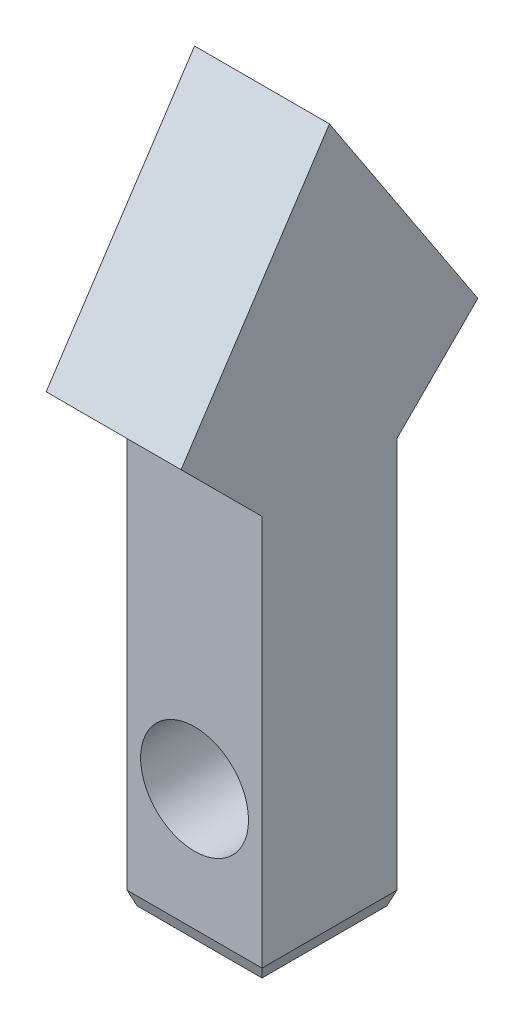
ISO-10303-21;
HEADER;
FILE_DESCRIPTION(('STEP AP214'),'2;1');
FILE_NAME('part.step','',(''),(''),'','','');
FILE_SCHEMA(('AUTOMOTIVE_DESIGN { 1 0 10303 214 1 1 1 1 }'));
ENDSEC;
DATA;
#1=APPLICATION_CONTEXT('core data for automotive mechanical design processes');
#2=APPLICATION_PROTOCOL_DEFINITION('international standard','automotive_design',2000,#1);
#3=PRODUCT_CONTEXT('',#1,'mechanical');
#4=PRODUCT('Part','Part','',(#3));
#5=PRODUCT_RELATED_PRODUCT_CATEGORY('part','',(#4));
#6=PRODUCT_DEFINITION_FORMATION('','',#4);
#7=PRODUCT_DEFINITION_CONTEXT('part definition',#1,'design');
#8=PRODUCT_DEFINITION('design','',#6,#7);
#9=PRODUCT_DEFINITION_SHAPE('','',#8);
#10=(LENGTH_UNIT() NAMED_UNIT(*) SI_UNIT(.MILLI.,.METRE.));
#11=(NAMED_UNIT(*) PLANE_ANGLE_UNIT() SI_UNIT($,.RADIAN.));
#12=(NAMED_UNIT(*) SI_UNIT($,.STERADIAN.) SOLID_ANGLE_UNIT());
#13=UNCERTAINTY_MEASURE_WITH_UNIT(LENGTH_MEASURE(1.E-05),#10,'distance_accuracy_value','');
#14=(GEOMETRIC_REPRESENTATION_CONTEXT(3) GLOBAL_UNCERTAINTY_ASSIGNED_CONTEXT((#13)) GLOBAL_UNIT_ASSIGNED_CONTEXT((#10,
#11,#12)) REPRESENTATION_CONTEXT('',''));
#15=CARTESIAN_POINT('',(0.,0.,0.));
#16=DIRECTION('',(0.,0.,1.));
#17=DIRECTION('',(1.,0.,0.));
#18=AXIS2_PLACEMENT_3D('',#15,#16,#17);
#19=CARTESIAN_POINT('',(5.,1.99999999999999,8.));
#20=DIRECTION('',(0.,0.707106781186547,-0.707106781186549));
#21=DIRECTION('',(0.,0.707106781186549,0.707106781186547));
#22=AXIS2_PLACEMENT_3D('',#19,#20,#21);
#23=PLANE('',#22);
#24=DIRECTION('',(0.,-0.707106781186549,-0.707106781186547));
#25=VECTOR('',#24,1.);
#26=CARTESIAN_POINT('',(0.,1.99999999999999,8.));
#27=LINE('',#26,#25);
#28=CARTESIAN_POINT('',(0.,5.,11.));
#29=VERTEX_POINT('',#28);
#30=CARTESIAN_POINT('',(0.,1.99999999999999,8.));
#31=VERTEX_POINT('',#30);
#32=EDGE_CURVE('E137',#29,#31,#27,.T.);
#33=ORIENTED_EDGE('',*,*,#32,.T.);
#34=DIRECTION('',(-1.,0.,0.));
#35=VECTOR('',#34,1.);
#36=CARTESIAN_POINT('',(5.,1.99999999999999,8.));
#37=LINE('',#36,#35);
#38=CARTESIAN_POINT('',(5.,1.99999999999999,8.));
#39=VERTEX_POINT('',#38);
#40=EDGE_CURVE('E118',#39,#31,#37,.T.);
#41=ORIENTED_EDGE('',*,*,#40,.F.);
#42=DIRECTION('',(0.,-0.707106781186549,-0.707106781186547));
#43=VECTOR('',#42,1.);
#44=CARTESIAN_POINT('',(5.,1.99999999999999,8.));
#45=LINE('',#44,#43);
#46=CARTESIAN_POINT('',(5.,5.,11.));
#47=VERTEX_POINT('',#46);
#48=EDGE_CURVE('E125',#47,#39,#45,.T.);
#49=ORIENTED_EDGE('',*,*,#48,.F.);
#50=DIRECTION('',(-1.,0.,0.));
#51=VECTOR('',#50,1.);
#52=CARTESIAN_POINT('',(5.,5.,11.));
#53=LINE('',#52,#51);
#54=EDGE_CURVE('E185',#47,#29,#53,.T.);
#55=ORIENTED_EDGE('',*,*,#54,.T.);
#56=EDGE_LOOP('',(#33,#41,#49,#55));
#57=FACE_BOUND('',#56,.T.);
#58=ADVANCED_FACE('F41',(#57),#23,.F.);
#59=CARTESIAN_POINT('',(5.,-3.,8.));
#60=DIRECTION('',(0.,0.,-1.));
#61=DIRECTION('',(0.,1.,0.));
#62=AXIS2_PLACEMENT_3D('',#59,#60,#61);
#63=PLANE('',#62);
#64=CARTESIAN_POINT('',(2.5,-7.99999999999999,8.));
#65=DIRECTION('',(0.,0.,1.));
#66=DIRECTION('',(1.,0.,0.));
#67=AXIS2_PLACEMENT_3D('',#64,#65,#66);
#68=CIRCLE('',#67,2.);
#69=CARTESIAN_POINT('',(4.5,-7.99999999999999,8.));
#70=VERTEX_POINT('',#69);
#71=EDGE_CURVE('E150',#70,#70,#68,.T.);
#72=ORIENTED_EDGE('',*,*,#71,.F.);
#73=EDGE_LOOP('',(#72));
#74=FACE_BOUND('',#73,.T.);
#75=DIRECTION('',(0.,-1.,0.));
#76=VECTOR('',#75,1.);
#77=CARTESIAN_POINT('',(0.,-3.,8.));
#78=LINE('',#77,#76);
#79=CARTESIAN_POINT('',(0.,-12.5,8.));
#80=VERTEX_POINT('',#79);
#81=EDGE_CURVE('E187',#31,#80,#78,.T.);
#82=ORIENTED_EDGE('',*,*,#81,.T.);
#83=DIRECTION('',(1.,0.,0.));
#84=VECTOR('',#83,1.);
#85=CARTESIAN_POINT('',(5.,-12.5,8.));
#86=LINE('',#85,#84);
#87=CARTESIAN_POINT('',(5.,-12.5,8.));
#88=VERTEX_POINT('',#87);
#89=EDGE_CURVE('E11',#80,#88,#86,.T.);
#90=ORIENTED_EDGE('',*,*,#89,.T.);
#91=DIRECTION('',(0.,-1.,0.));
#92=VECTOR('',#91,1.);
#93=CARTESIAN_POINT('',(5.,-3.,8.));
#94=LINE('',#93,#92);
#95=EDGE_CURVE('E114',#39,#88,#94,.T.);
#96=ORIENTED_EDGE('',*,*,#95,.F.);
#97=ORIENTED_EDGE('',*,*,#40,.T.);
#98=EDGE_LOOP('',(#82,#90,#96,#97));
#99=FACE_BOUND('',#98,.T.);
#100=ADVANCED_FACE('F116',(#74,#99),#63,.F.);
#101=CARTESIAN_POINT('',(5.,-13.,8.));
#102=DIRECTION('',(0.,1.,0.));
#103=DIRECTION('',(0.,0.,1.));
#104=AXIS2_PLACEMENT_3D('',#101,#102,#103);
#105=PLANE('',#104);
#106=DIRECTION('',(1.,0.,0.));
#107=VECTOR('',#106,1.);
#108=CARTESIAN_POINT('',(5.,-13.,3.18198511713311));
#109=LINE('',#108,#107);
#110=CARTESIAN_POINT('',(0.181985117133104,-13.,3.18198511713311));
#111=VERTEX_POINT('',#110);
#112=CARTESIAN_POINT('',(4.8180148828669,-13.,3.18198511713311));
#113=VERTEX_POINT('',#112);
#114=EDGE_CURVE('E155',#111,#113,#109,.T.);
#115=ORIENTED_EDGE('',*,*,#114,.T.);
#116=DIRECTION('',(0.,0.,1.));
#117=VECTOR('',#116,1.);
#118=CARTESIAN_POINT('',(4.8180148828669,-13.,8.));
#119=LINE('',#118,#117);
#120=CARTESIAN_POINT('',(4.8180148828669,-13.,7.8180148828669));
#121=VERTEX_POINT('',#120);
#122=EDGE_CURVE('E157',#113,#121,#119,.T.);
#123=ORIENTED_EDGE('',*,*,#122,.T.);
#124=DIRECTION('',(-1.,0.,0.));
#125=VECTOR('',#124,1.);
#126=CARTESIAN_POINT('',(5.,-13.,7.8180148828669));
#127=LINE('',#126,#125);
#128=CARTESIAN_POINT('',(0.181985117133104,-13.,7.8180148828669));
#129=VERTEX_POINT('',#128);
#130=EDGE_CURVE('E141',#121,#129,#127,.T.);
#131=ORIENTED_EDGE('',*,*,#130,.T.);
#132=DIRECTION('',(0.,0.,-1.));
#133=VECTOR('',#132,1.);
#134=CARTESIAN_POINT('',(0.181985117133104,-13.,3.));
#135=LINE('',#134,#133);
#136=EDGE_CURVE('E153',#129,#111,#135,.T.);
#137=ORIENTED_EDGE('',*,*,#136,.T.);
#138=EDGE_LOOP('',(#115,#123,#131,#137));
#139=FACE_BOUND('',#138,.T.);
#140=ADVANCED_FACE('F230',(#139),#105,.F.);
#141=CARTESIAN_POINT('',(5.,-2.99999999999999,3.));
#142=DIRECTION('',(0.,0.,1.));
#143=DIRECTION('',(1.,0.,0.));
#144=AXIS2_PLACEMENT_3D('',#141,#142,#143);
#145=PLANE('',#144);
#146=CARTESIAN_POINT('',(2.5,-7.99999999999999,3.));
#147=DIRECTION('',(0.,0.,1.));
#148=DIRECTION('',(1.,0.,0.));
#149=AXIS2_PLACEMENT_3D('',#146,#147,#148);
#150=CIRCLE('',#149,2.);
#151=CARTESIAN_POINT('',(4.5,-7.99999999999999,3.));
#152=VERTEX_POINT('',#151);
#153=EDGE_CURVE('E148',#152,#152,#150,.T.);
#154=ORIENTED_EDGE('',*,*,#153,.T.);
#155=EDGE_LOOP('',(#154));
#156=FACE_BOUND('',#155,.T.);
#157=DIRECTION('',(0.,1.,0.));
#158=VECTOR('',#157,1.);
#159=CARTESIAN_POINT('',(5.,-13.,3.));
#160=LINE('',#159,#158);
#161=CARTESIAN_POINT('',(5.,-12.5,3.));
#162=VERTEX_POINT('',#161);
#163=CARTESIAN_POINT('',(5.,1.99999999999999,3.));
#164=VERTEX_POINT('',#163);
#165=EDGE_CURVE('E124',#162,#164,#160,.T.);
#166=ORIENTED_EDGE('',*,*,#165,.F.);
#167=DIRECTION('',(-1.,0.,0.));
#168=VECTOR('',#167,1.);
#169=CARTESIAN_POINT('',(5.,-12.5,3.));
#170=LINE('',#169,#168);
#171=CARTESIAN_POINT('',(0.,-12.5,3.));
#172=VERTEX_POINT('',#171);
#173=EDGE_CURVE('E66',#162,#172,#170,.T.);
#174=ORIENTED_EDGE('',*,*,#173,.T.);
#175=DIRECTION('',(0.,1.,0.));
#176=VECTOR('',#175,1.);
#177=CARTESIAN_POINT('',(0.,-2.99999999999999,3.));
#178=LINE('',#177,#176);
#179=CARTESIAN_POINT('',(0.,1.99999999999999,3.));
#180=VERTEX_POINT('',#179);
#181=EDGE_CURVE('E189',#172,#180,#178,.T.);
#182=ORIENTED_EDGE('',*,*,#181,.T.);
#183=DIRECTION('',(-1.,0.,0.));
#184=VECTOR('',#183,1.);
#185=CARTESIAN_POINT('',(5.,1.99999999999999,3.));
#186=LINE('',#185,#184);
#187=EDGE_CURVE('E139',#164,#180,#186,.T.);
#188=ORIENTED_EDGE('',*,*,#187,.F.);
#189=EDGE_LOOP('',(#166,#174,#182,#188));
#190=FACE_BOUND('',#189,.T.);
#191=ADVANCED_FACE('F267',(#156,#190),#145,.F.);
#192=CARTESIAN_POINT('',(5.,1.99999999999999,3.));
#193=DIRECTION('',(0.,0.707106781186547,0.707106781186548));
#194=DIRECTION('',(0.,-0.707106781186548,0.707106781186547));
#195=AXIS2_PLACEMENT_3D('',#192,#193,#194);
#196=PLANE('',#195);
#197=DIRECTION('',(0.,0.707106781186548,-0.707106781186547));
#198=VECTOR('',#197,1.);
#199=CARTESIAN_POINT('',(0.,1.99999999999999,3.));
#200=LINE('',#199,#198);
#201=CARTESIAN_POINT('',(0.,5.,0.));
#202=VERTEX_POINT('',#201);
#203=EDGE_CURVE('E191',#180,#202,#200,.T.);
#204=ORIENTED_EDGE('',*,*,#203,.T.);
#205=DIRECTION('',(-1.,0.,0.));
#206=VECTOR('',#205,1.);
#207=CARTESIAN_POINT('',(5.,5.,0.));
#208=LINE('',#207,#206);
#209=CARTESIAN_POINT('',(5.,5.,0.));
#210=VERTEX_POINT('',#209);
#211=EDGE_CURVE('E144',#210,#202,#208,.T.);
#212=ORIENTED_EDGE('',*,*,#211,.F.);
#213=DIRECTION('',(0.,0.707106781186548,-0.707106781186547));
#214=VECTOR('',#213,1.);
#215=CARTESIAN_POINT('',(5.,1.99999999999999,3.));
#216=LINE('',#215,#214);
#217=EDGE_CURVE('E180',#164,#210,#216,.T.);
#218=ORIENTED_EDGE('',*,*,#217,.F.);
#219=ORIENTED_EDGE('',*,*,#187,.T.);
#220=EDGE_LOOP('',(#204,#212,#218,#219));
#221=FACE_BOUND('',#220,.T.);
#222=ADVANCED_FACE('F221',(#221),#196,.F.);
#223=CARTESIAN_POINT('',(5.,13.351646544245,5.5));
#224=DIRECTION('',(0.,-0.55,0.835164654424503));
#225=DIRECTION('',(0.,-0.835164654424503,-0.55));
#226=AXIS2_PLACEMENT_3D('',#223,#224,#225);
#227=PLANE('',#226);
#228=DIRECTION('',(0.,0.835164654424503,0.55));
#229=VECTOR('',#228,1.);
#230=CARTESIAN_POINT('',(0.,13.351646544245,5.5));
#231=LINE('',#230,#229);
#232=CARTESIAN_POINT('',(0.,13.351646544245,5.5));
#233=VERTEX_POINT('',#232);
#234=EDGE_CURVE('E193',#202,#233,#231,.T.);
#235=ORIENTED_EDGE('',*,*,#234,.T.);
#236=DIRECTION('',(-1.,0.,0.));
#237=VECTOR('',#236,1.);
#238=CARTESIAN_POINT('',(5.,13.351646544245,5.5));
#239=LINE('',#238,#237);
#240=CARTESIAN_POINT('',(5.,13.351646544245,5.5));
#241=VERTEX_POINT('',#240);
#242=EDGE_CURVE('E197',#241,#233,#239,.T.);
#243=ORIENTED_EDGE('',*,*,#242,.F.);
#244=DIRECTION('',(0.,0.835164654424503,0.55));
#245=VECTOR('',#244,1.);
#246=CARTESIAN_POINT('',(5.,13.351646544245,5.5));
#247=LINE('',#246,#245);
#248=EDGE_CURVE('E182',#210,#241,#247,.T.);
#249=ORIENTED_EDGE('',*,*,#248,.F.);
#250=ORIENTED_EDGE('',*,*,#211,.T.);
#251=EDGE_LOOP('',(#235,#243,#249,#250));
#252=FACE_BOUND('',#251,.T.);
#253=ADVANCED_FACE('F204',(#252),#227,.F.);
#254=CARTESIAN_POINT('',(5.,5.,11.));
#255=DIRECTION('',(0.,-0.55,-0.835164654424503));
#256=DIRECTION('',(0.,0.835164654424504,-0.55));
#257=AXIS2_PLACEMENT_3D('',#254,#255,#256);
#258=PLANE('',#257);
#259=DIRECTION('',(0.,-0.835164654424503,0.55));
#260=VECTOR('',#259,1.);
#261=CARTESIAN_POINT('',(0.,5.,11.));
#262=LINE('',#261,#260);
#263=EDGE_CURVE('E134',#233,#29,#262,.T.);
#264=ORIENTED_EDGE('',*,*,#263,.T.);
#265=ORIENTED_EDGE('',*,*,#54,.F.);
#266=DIRECTION('',(0.,-0.835164654424503,0.55));
#267=VECTOR('',#266,1.);
#268=CARTESIAN_POINT('',(5.,5.,11.));
#269=LINE('',#268,#267);
#270=EDGE_CURVE('E130',#241,#47,#269,.T.);
#271=ORIENTED_EDGE('',*,*,#270,.F.);
#272=ORIENTED_EDGE('',*,*,#242,.T.);
#273=EDGE_LOOP('',(#264,#265,#271,#272));
#274=FACE_BOUND('',#273,.T.);
#275=ADVANCED_FACE('F212',(#274),#258,.F.);
#276=CARTESIAN_POINT('',(5.,0.,0.));
#277=DIRECTION('',(-1.,0.,0.));
#278=DIRECTION('',(0.,0.,1.));
#279=AXIS2_PLACEMENT_3D('',#276,#277,#278);
#280=PLANE('',#279);
#281=ORIENTED_EDGE('',*,*,#95,.T.);
#282=DIRECTION('',(0.,0.,-1.));
#283=VECTOR('',#282,1.);
#284=CARTESIAN_POINT('',(5.,-12.5,0.));
#285=LINE('',#284,#283);
#286=EDGE_CURVE('E138',#88,#162,#285,.T.);
#287=ORIENTED_EDGE('',*,*,#286,.T.);
#288=ORIENTED_EDGE('',*,*,#165,.T.);
#289=ORIENTED_EDGE('',*,*,#217,.T.);
#290=ORIENTED_EDGE('',*,*,#248,.T.);
#291=ORIENTED_EDGE('',*,*,#270,.T.);
#292=ORIENTED_EDGE('',*,*,#48,.T.);
#293=EDGE_LOOP('',(#281,#287,#288,#289,#290,#291,#292));
#294=FACE_BOUND('',#293,.T.);
#295=ADVANCED_FACE('F128',(#294),#280,.F.);
#296=CARTESIAN_POINT('',(0.,0.,0.));
#297=DIRECTION('',(-1.,0.,0.));
#298=DIRECTION('',(0.,0.,1.));
#299=AXIS2_PLACEMENT_3D('',#296,#297,#298);
#300=PLANE('',#299);
#301=ORIENTED_EDGE('',*,*,#181,.F.);
#302=DIRECTION('',(0.,0.,1.));
#303=VECTOR('',#302,1.);
#304=CARTESIAN_POINT('',(0.,-12.5,8.));
#305=LINE('',#304,#303);
#306=EDGE_CURVE('E51',#172,#80,#305,.T.);
#307=ORIENTED_EDGE('',*,*,#306,.T.);
#308=ORIENTED_EDGE('',*,*,#81,.F.);
#309=ORIENTED_EDGE('',*,*,#32,.F.);
#310=ORIENTED_EDGE('',*,*,#263,.F.);
#311=ORIENTED_EDGE('',*,*,#234,.F.);
#312=ORIENTED_EDGE('',*,*,#203,.F.);
#313=EDGE_LOOP('',(#301,#307,#308,#309,#310,#311,#312));
#314=FACE_BOUND('',#313,.T.);
#315=ADVANCED_FACE('F210',(#314),#300,.T.);
#316=CARTESIAN_POINT('',(2.5,-7.99999999999999,-2.));
#317=DIRECTION('',(0.,0.,1.));
#318=DIRECTION('',(1.,0.,0.));
#319=AXIS2_PLACEMENT_3D('',#316,#317,#318);
#320=CYLINDRICAL_SURFACE('',#319,2.);
#321=ORIENTED_EDGE('',*,*,#71,.T.);
#322=EDGE_LOOP('',(#321));
#323=FACE_BOUND('',#322,.T.);
#324=ORIENTED_EDGE('',*,*,#153,.F.);
#325=EDGE_LOOP('',(#324));
#326=FACE_BOUND('',#325,.T.);
#327=ADVANCED_FACE('F255',(#323,#326),#320,.F.);
#328=CARTESIAN_POINT('',(0.181985117133104,-13.,8.));
#329=DIRECTION('',(-0.939692620785908,-0.342020143325669,0.));
#330=DIRECTION('',(0.,0.,1.));
#331=AXIS2_PLACEMENT_3D('',#328,#329,#330);
#332=PLANE('',#331);
#333=DIRECTION('',(-0.323615577118185,0.889126490715987,-0.323615577118188));
#334=VECTOR('',#333,1.);
#335=CARTESIAN_POINT('',(0.686561562940267,-14.3863123912438,3.68656156294027));
#336=LINE('',#335,#334);
#337=EDGE_CURVE('E165',#111,#172,#336,.T.);
#338=ORIENTED_EDGE('',*,*,#337,.F.);
#339=ORIENTED_EDGE('',*,*,#136,.F.);
#340=DIRECTION('',(-0.323615577118185,0.889126490715987,0.323615577118186));
#341=VECTOR('',#340,1.);
#342=CARTESIAN_POINT('',(0.686561562940263,-14.3863123912438,7.31343843705973));
#343=LINE('',#342,#341);
#344=EDGE_CURVE('E46',#80,#129,#343,.F.);
#345=ORIENTED_EDGE('',*,*,#344,.F.);
#346=ORIENTED_EDGE('',*,*,#306,.F.);
#347=EDGE_LOOP('',(#338,#339,#345,#346));
#348=FACE_BOUND('',#347,.T.);
#349=ADVANCED_FACE('F44',(#348),#332,.T.);
#350=CARTESIAN_POINT('',(5.,-13.,7.8180148828669));
#351=DIRECTION('',(0.,0.342020143325671,-0.939692620785908));
#352=DIRECTION('',(-1.,0.,0.));
#353=AXIS2_PLACEMENT_3D('',#350,#351,#352);
#354=PLANE('',#353);
#355=ORIENTED_EDGE('',*,*,#344,.T.);
#356=ORIENTED_EDGE('',*,*,#130,.F.);
#357=DIRECTION('',(0.323615577118185,0.889126490715987,0.323615577118186));
#358=VECTOR('',#357,1.);
#359=CARTESIAN_POINT('',(4.83707364582742,-12.9476364791232,7.83707364582742));
#360=LINE('',#359,#358);
#361=EDGE_CURVE('E164',#88,#121,#360,.F.);
#362=ORIENTED_EDGE('',*,*,#361,.F.);
#363=ORIENTED_EDGE('',*,*,#89,.F.);
#364=EDGE_LOOP('',(#355,#356,#362,#363));
#365=FACE_BOUND('',#364,.T.);
#366=ADVANCED_FACE('F248',(#365),#354,.F.);
#367=CARTESIAN_POINT('',(5.,-12.5,3.));
#368=DIRECTION('',(0.,0.342020143325672,0.939692620785907));
#369=DIRECTION('',(-1.,0.,0.));
#370=AXIS2_PLACEMENT_3D('',#367,#368,#369);
#371=PLANE('',#370);
#372=ORIENTED_EDGE('',*,*,#337,.T.);
#373=ORIENTED_EDGE('',*,*,#173,.F.);
#374=DIRECTION('',(-0.323615577118185,-0.889126490715987,0.323615577118188));
#375=VECTOR('',#374,1.);
#376=CARTESIAN_POINT('',(5.,-12.5,3.));
#377=LINE('',#376,#375);
#378=EDGE_CURVE('E162',#113,#162,#377,.F.);
#379=ORIENTED_EDGE('',*,*,#378,.F.);
#380=ORIENTED_EDGE('',*,*,#114,.F.);
#381=EDGE_LOOP('',(#372,#373,#379,#380));
#382=FACE_BOUND('',#381,.T.);
#383=ADVANCED_FACE('F242',(#382),#371,.F.);
#384=CARTESIAN_POINT('',(5.,-12.5,0.));
#385=DIRECTION('',(-0.939692620785908,0.342020143325669,0.));
#386=DIRECTION('',(0.,0.,-1.));
#387=AXIS2_PLACEMENT_3D('',#384,#385,#386);
#388=PLANE('',#387);
#389=ORIENTED_EDGE('',*,*,#361,.T.);
#390=ORIENTED_EDGE('',*,*,#122,.F.);
#391=ORIENTED_EDGE('',*,*,#378,.T.);
#392=ORIENTED_EDGE('',*,*,#286,.F.);
#393=EDGE_LOOP('',(#389,#390,#391,#392));
#394=FACE_BOUND('',#393,.T.);
#395=ADVANCED_FACE('F236',(#394),#388,.F.);
#396=CLOSED_SHELL('',(#58,#100,#140,#191,#222,#253,#275,#295,#315,#327,#349,#366,#383,#395));
#397=MANIFOLD_SOLID_BREP('B2',#396);
#398=ADVANCED_BREP_SHAPE_REPRESENTATION('',(#18,#397),#14);
#399=SHAPE_DEFINITION_REPRESENTATION(#9,#398);
ENDSEC;
END-ISO-10303-21;
